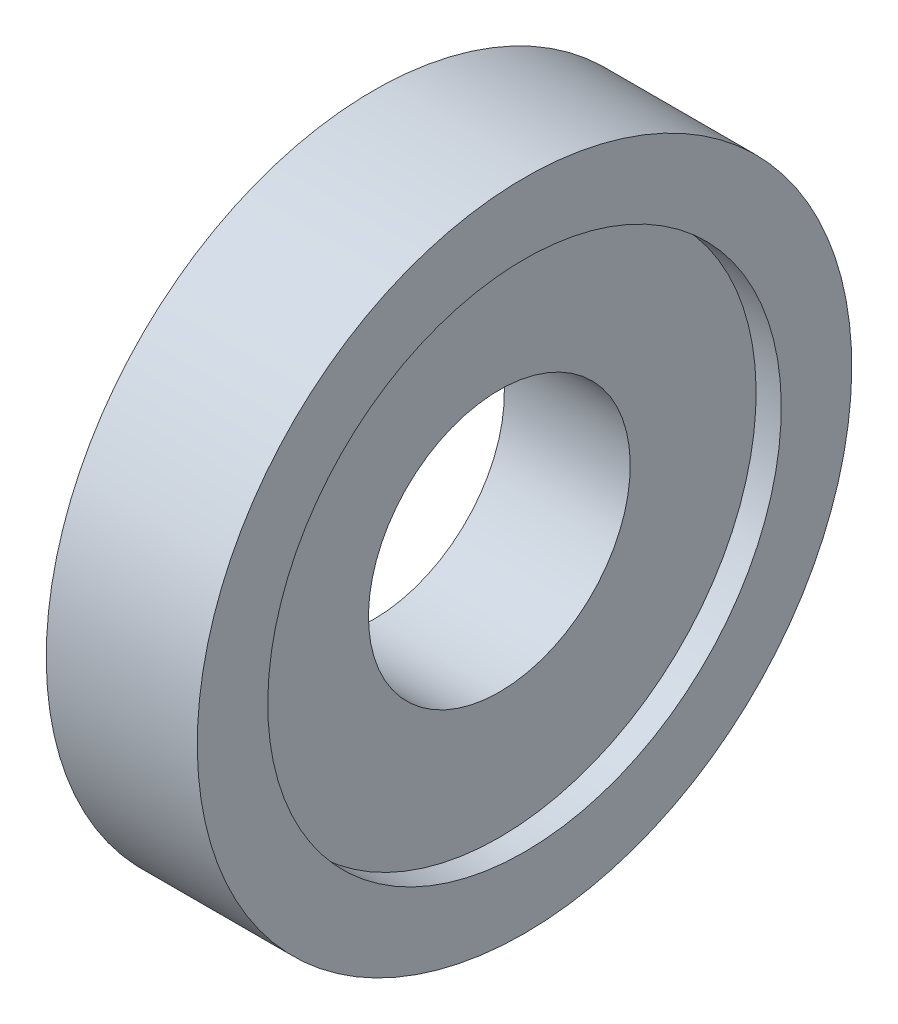
ISO-10303-21;
HEADER;
FILE_DESCRIPTION(('STEP AP214'),'2;1');
FILE_NAME('part.step','',(''),(''),'','','');
FILE_SCHEMA(('AUTOMOTIVE_DESIGN { 1 0 10303 214 1 1 1 1 }'));
ENDSEC;
DATA;
#1=APPLICATION_CONTEXT('core data for automotive mechanical design processes');
#2=APPLICATION_PROTOCOL_DEFINITION('international standard','automotive_design',2000,#1);
#3=PRODUCT_CONTEXT('',#1,'mechanical');
#4=PRODUCT('Part','Part','',(#3));
#5=PRODUCT_RELATED_PRODUCT_CATEGORY('part','',(#4));
#6=PRODUCT_DEFINITION_FORMATION('','',#4);
#7=PRODUCT_DEFINITION_CONTEXT('part definition',#1,'design');
#8=PRODUCT_DEFINITION('design','',#6,#7);
#9=PRODUCT_DEFINITION_SHAPE('','',#8);
#10=(LENGTH_UNIT() NAMED_UNIT(*) SI_UNIT(.MILLI.,.METRE.));
#11=(NAMED_UNIT(*) PLANE_ANGLE_UNIT() SI_UNIT($,.RADIAN.));
#12=(NAMED_UNIT(*) SI_UNIT($,.STERADIAN.) SOLID_ANGLE_UNIT());
#13=UNCERTAINTY_MEASURE_WITH_UNIT(LENGTH_MEASURE(1.E-05),#10,'distance_accuracy_value','');
#14=(GEOMETRIC_REPRESENTATION_CONTEXT(3) GLOBAL_UNCERTAINTY_ASSIGNED_CONTEXT((#13)) GLOBAL_UNIT_ASSIGNED_CONTEXT((#10,
#11,#12)) REPRESENTATION_CONTEXT('',''));
#15=CARTESIAN_POINT('',(0.,0.,0.));
#16=DIRECTION('',(0.,0.,1.));
#17=DIRECTION('',(1.,0.,0.));
#18=AXIS2_PLACEMENT_3D('',#15,#16,#17);
#19=CARTESIAN_POINT('',(0.,0.,0.));
#20=DIRECTION('',(-1.,0.,0.));
#21=DIRECTION('',(0.,-1.,0.));
#22=AXIS2_PLACEMENT_3D('',#19,#20,#21);
#23=CYLINDRICAL_SURFACE('',#22,2.6);
#24=CARTESIAN_POINT('',(2.5,0.,0.));
#25=DIRECTION('',(-1.,0.,0.));
#26=DIRECTION('',(0.,-1.,0.));
#27=AXIS2_PLACEMENT_3D('',#24,#25,#26);
#28=CIRCLE('',#27,2.6);
#29=CARTESIAN_POINT('',(2.5,-2.6,0.));
#30=VERTEX_POINT('',#29);
#31=EDGE_CURVE('E57',#30,#30,#28,.T.);
#32=ORIENTED_EDGE('',*,*,#31,.F.);
#33=EDGE_LOOP('',(#32));
#34=FACE_BOUND('',#33,.T.);
#35=CARTESIAN_POINT('',(0.,0.,0.));
#36=DIRECTION('',(-1.,0.,0.));
#37=DIRECTION('',(0.,-1.,0.));
#38=AXIS2_PLACEMENT_3D('',#35,#36,#37);
#39=CIRCLE('',#38,2.6);
#40=CARTESIAN_POINT('',(0.,-2.6,0.));
#41=VERTEX_POINT('',#40);
#42=EDGE_CURVE('E10',#41,#41,#39,.T.);
#43=ORIENTED_EDGE('',*,*,#42,.T.);
#44=EDGE_LOOP('',(#43));
#45=FACE_BOUND('',#44,.T.);
#46=ADVANCED_FACE('F35',(#34,#45),#23,.F.);
#47=CARTESIAN_POINT('',(0.,2.6,0.));
#48=DIRECTION('',(1.,0.,0.));
#49=DIRECTION('',(0.,1.,0.));
#50=AXIS2_PLACEMENT_3D('',#47,#48,#49);
#51=PLANE('',#50);
#52=ORIENTED_EDGE('',*,*,#42,.F.);
#53=EDGE_LOOP('',(#52));
#54=FACE_BOUND('',#53,.T.);
#55=CARTESIAN_POINT('',(0.,0.,0.));
#56=DIRECTION('',(-1.,0.,0.));
#57=DIRECTION('',(0.,-1.,0.));
#58=AXIS2_PLACEMENT_3D('',#55,#56,#57);
#59=CIRCLE('',#58,6.5);
#60=CARTESIAN_POINT('',(0.,-6.5,0.));
#61=VERTEX_POINT('',#60);
#62=EDGE_CURVE('E41',#61,#61,#59,.T.);
#63=ORIENTED_EDGE('',*,*,#62,.T.);
#64=EDGE_LOOP('',(#63));
#65=FACE_BOUND('',#64,.T.);
#66=ADVANCED_FACE('F64',(#54,#65),#51,.F.);
#67=CARTESIAN_POINT('',(0.,0.,0.));
#68=DIRECTION('',(-1.,0.,0.));
#69=DIRECTION('',(0.,-1.,0.));
#70=AXIS2_PLACEMENT_3D('',#67,#68,#69);
#71=CYLINDRICAL_SURFACE('',#70,6.5);
#72=ORIENTED_EDGE('',*,*,#62,.F.);
#73=EDGE_LOOP('',(#72));
#74=FACE_BOUND('',#73,.T.);
#75=CARTESIAN_POINT('',(3.,0.,0.));
#76=DIRECTION('',(-1.,0.,0.));
#77=DIRECTION('',(0.,-1.,0.));
#78=AXIS2_PLACEMENT_3D('',#75,#76,#77);
#79=CIRCLE('',#78,6.5);
#80=CARTESIAN_POINT('',(3.,-6.5,0.));
#81=VERTEX_POINT('',#80);
#82=EDGE_CURVE('E45',#81,#81,#79,.T.);
#83=ORIENTED_EDGE('',*,*,#82,.T.);
#84=EDGE_LOOP('',(#83));
#85=FACE_BOUND('',#84,.T.);
#86=ADVANCED_FACE('F68',(#74,#85),#71,.T.);
#87=CARTESIAN_POINT('',(3.,6.5,0.));
#88=DIRECTION('',(-1.,0.,0.));
#89=DIRECTION('',(0.,-1.,0.));
#90=AXIS2_PLACEMENT_3D('',#87,#88,#89);
#91=PLANE('',#90);
#92=ORIENTED_EDGE('',*,*,#82,.F.);
#93=EDGE_LOOP('',(#92));
#94=FACE_BOUND('',#93,.T.);
#95=CARTESIAN_POINT('',(3.,0.,0.));
#96=DIRECTION('',(-1.,0.,0.));
#97=DIRECTION('',(0.,-1.,0.));
#98=AXIS2_PLACEMENT_3D('',#95,#96,#97);
#99=CIRCLE('',#98,5.1);
#100=CARTESIAN_POINT('',(3.,-5.1,0.));
#101=VERTEX_POINT('',#100);
#102=EDGE_CURVE('E49',#101,#101,#99,.T.);
#103=ORIENTED_EDGE('',*,*,#102,.T.);
#104=EDGE_LOOP('',(#103));
#105=FACE_BOUND('',#104,.T.);
#106=ADVANCED_FACE('F73',(#94,#105),#91,.F.);
#107=CARTESIAN_POINT('',(0.,0.,0.));
#108=DIRECTION('',(-1.,0.,0.));
#109=DIRECTION('',(0.,-1.,0.));
#110=AXIS2_PLACEMENT_3D('',#107,#108,#109);
#111=CYLINDRICAL_SURFACE('',#110,5.1);
#112=ORIENTED_EDGE('',*,*,#102,.F.);
#113=EDGE_LOOP('',(#112));
#114=FACE_BOUND('',#113,.T.);
#115=CARTESIAN_POINT('',(2.5,0.,0.));
#116=DIRECTION('',(-1.,0.,0.));
#117=DIRECTION('',(0.,-1.,0.));
#118=AXIS2_PLACEMENT_3D('',#115,#116,#117);
#119=CIRCLE('',#118,5.1);
#120=CARTESIAN_POINT('',(2.5,-5.1,0.));
#121=VERTEX_POINT('',#120);
#122=EDGE_CURVE('E54',#121,#121,#119,.T.);
#123=ORIENTED_EDGE('',*,*,#122,.T.);
#124=EDGE_LOOP('',(#123));
#125=FACE_BOUND('',#124,.T.);
#126=ADVANCED_FACE('F79',(#114,#125),#111,.F.);
#127=CARTESIAN_POINT('',(2.5,5.1,0.));
#128=DIRECTION('',(-1.,0.,0.));
#129=DIRECTION('',(0.,-1.,0.));
#130=AXIS2_PLACEMENT_3D('',#127,#128,#129);
#131=PLANE('',#130);
#132=ORIENTED_EDGE('',*,*,#122,.F.);
#133=EDGE_LOOP('',(#132));
#134=FACE_BOUND('',#133,.T.);
#135=ORIENTED_EDGE('',*,*,#31,.T.);
#136=EDGE_LOOP('',(#135));
#137=FACE_BOUND('',#136,.T.);
#138=ADVANCED_FACE('F61',(#134,#137),#131,.F.);
#139=CLOSED_SHELL('',(#46,#66,#86,#106,#126,#138));
#140=MANIFOLD_SOLID_BREP('B2',#139);
#141=ADVANCED_BREP_SHAPE_REPRESENTATION('',(#18,#140),#14);
#142=SHAPE_DEFINITION_REPRESENTATION(#9,#141);
ENDSEC;
END-ISO-10303-21;
